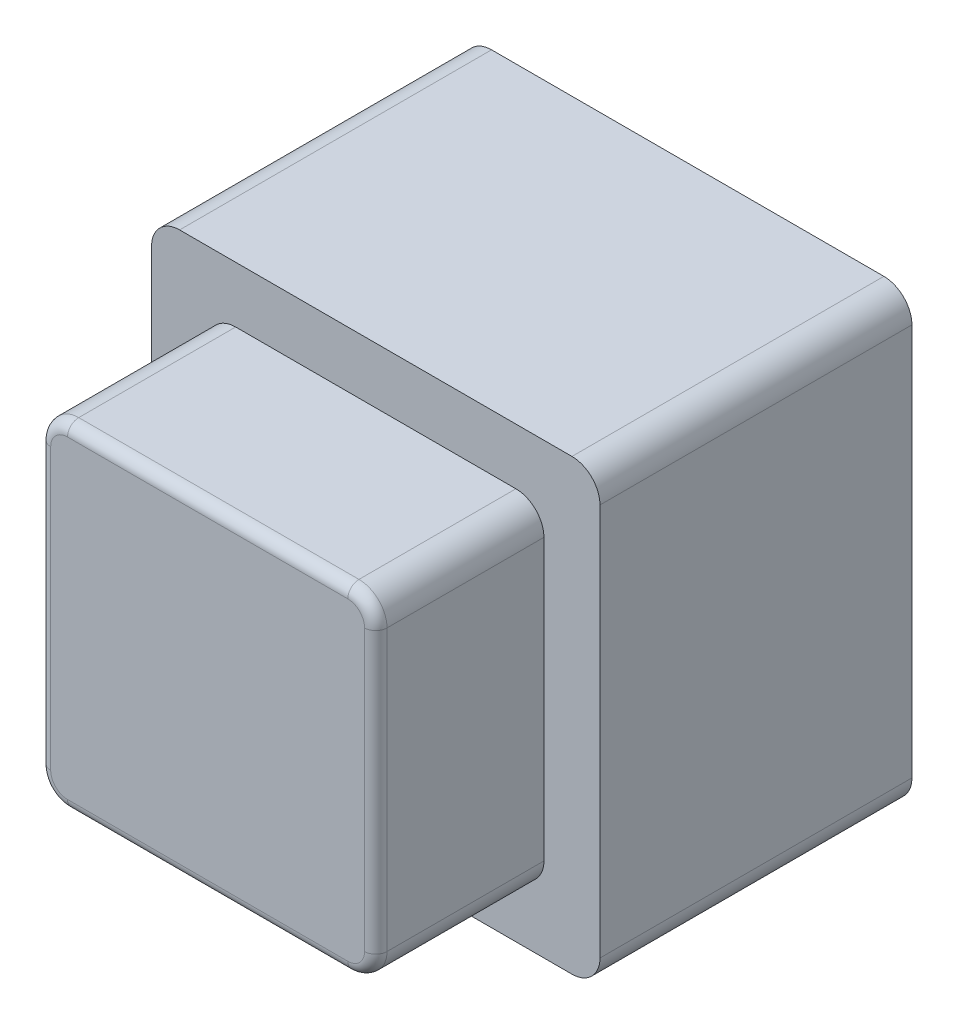
ISO-10303-21;
HEADER;
FILE_DESCRIPTION(('STEP AP214'),'2;1');
FILE_NAME('part.step','',(''),(''),'','','');
FILE_SCHEMA(('AUTOMOTIVE_DESIGN { 1 0 10303 214 1 1 1 1 }'));
ENDSEC;
DATA;
#1=APPLICATION_CONTEXT('core data for automotive mechanical design processes');
#2=APPLICATION_PROTOCOL_DEFINITION('international standard','automotive_design',2000,#1);
#3=PRODUCT_CONTEXT('',#1,'mechanical');
#4=PRODUCT('Part','Part','',(#3));
#5=PRODUCT_RELATED_PRODUCT_CATEGORY('part','',(#4));
#6=PRODUCT_DEFINITION_FORMATION('','',#4);
#7=PRODUCT_DEFINITION_CONTEXT('part definition',#1,'design');
#8=PRODUCT_DEFINITION('design','',#6,#7);
#9=PRODUCT_DEFINITION_SHAPE('','',#8);
#10=(LENGTH_UNIT() NAMED_UNIT(*) SI_UNIT(.MILLI.,.METRE.));
#11=(NAMED_UNIT(*) PLANE_ANGLE_UNIT() SI_UNIT($,.RADIAN.));
#12=(NAMED_UNIT(*) SI_UNIT($,.STERADIAN.) SOLID_ANGLE_UNIT());
#13=UNCERTAINTY_MEASURE_WITH_UNIT(LENGTH_MEASURE(1.E-05),#10,'distance_accuracy_value','');
#14=(GEOMETRIC_REPRESENTATION_CONTEXT(3) GLOBAL_UNCERTAINTY_ASSIGNED_CONTEXT((#13)) GLOBAL_UNIT_ASSIGNED_CONTEXT((#10,
#11,#12)) REPRESENTATION_CONTEXT('',''));
#15=CARTESIAN_POINT('',(0.,0.,0.));
#16=DIRECTION('',(0.,0.,1.));
#17=DIRECTION('',(1.,0.,0.));
#18=AXIS2_PLACEMENT_3D('',#15,#16,#17);
#19=CARTESIAN_POINT('',(-2.5,-2.5,3.));
#20=DIRECTION('',(0.,0.,-1.));
#21=DIRECTION('',(-1.,0.,0.));
#22=AXIS2_PLACEMENT_3D('',#19,#20,#21);
#23=CYLINDRICAL_SURFACE('',#22,0.5);
#24=DIRECTION('',(0.,0.,-1.));
#25=VECTOR('',#24,1.);
#26=CARTESIAN_POINT('',(-2.5,-3.,3.));
#27=LINE('',#26,#25);
#28=CARTESIAN_POINT('',(-2.5,-3.,2.8));
#29=VERTEX_POINT('',#28);
#30=CARTESIAN_POINT('',(-2.5,-3.,0.));
#31=VERTEX_POINT('',#30);
#32=EDGE_CURVE('E315',#29,#31,#27,.T.);
#33=ORIENTED_EDGE('',*,*,#32,.F.);
#34=CARTESIAN_POINT('',(-2.5,-2.5,2.8));
#35=DIRECTION('',(0.,0.,-1.));
#36=DIRECTION('',(-1.,0.,0.));
#37=AXIS2_PLACEMENT_3D('',#34,#35,#36);
#38=CIRCLE('',#37,0.5);
#39=CARTESIAN_POINT('',(-3.,-2.5,2.8));
#40=VERTEX_POINT('',#39);
#41=EDGE_CURVE('E354',#29,#40,#38,.T.);
#42=ORIENTED_EDGE('',*,*,#41,.T.);
#43=DIRECTION('',(0.,0.,-1.));
#44=VECTOR('',#43,1.);
#45=CARTESIAN_POINT('',(-3.,-2.5,3.));
#46=LINE('',#45,#44);
#47=CARTESIAN_POINT('',(-3.,-2.5,0.));
#48=VERTEX_POINT('',#47);
#49=EDGE_CURVE('E289',#40,#48,#46,.T.);
#50=ORIENTED_EDGE('',*,*,#49,.T.);
#51=CARTESIAN_POINT('',(-2.5,-2.5,0.));
#52=DIRECTION('',(0.,0.,1.));
#53=DIRECTION('',(-1.,0.,0.));
#54=AXIS2_PLACEMENT_3D('',#51,#52,#53);
#55=CIRCLE('',#54,0.5);
#56=EDGE_CURVE('E257',#48,#31,#55,.T.);
#57=ORIENTED_EDGE('',*,*,#56,.T.);
#58=EDGE_LOOP('',(#33,#42,#50,#57));
#59=FACE_BOUND('',#58,.T.);
#60=ADVANCED_FACE('F39',(#59),#23,.T.);
#61=CARTESIAN_POINT('',(-2.5,-3.,3.));
#62=DIRECTION('',(0.,1.,0.));
#63=DIRECTION('',(0.,0.,1.));
#64=AXIS2_PLACEMENT_3D('',#61,#62,#63);
#65=PLANE('',#64);
#66=DIRECTION('',(0.,0.,-1.));
#67=VECTOR('',#66,1.);
#68=CARTESIAN_POINT('',(2.5,-3.,3.));
#69=LINE('',#68,#67);
#70=CARTESIAN_POINT('',(2.5,-3.,2.8));
#71=VERTEX_POINT('',#70);
#72=CARTESIAN_POINT('',(2.5,-3.,0.));
#73=VERTEX_POINT('',#72);
#74=EDGE_CURVE('E311',#71,#73,#69,.T.);
#75=ORIENTED_EDGE('',*,*,#74,.F.);
#76=DIRECTION('',(1.,0.,0.));
#77=VECTOR('',#76,1.);
#78=CARTESIAN_POINT('',(-2.5,-3.,2.8));
#79=LINE('',#78,#77);
#80=EDGE_CURVE('E351',#71,#29,#79,.F.);
#81=ORIENTED_EDGE('',*,*,#80,.T.);
#82=ORIENTED_EDGE('',*,*,#32,.T.);
#83=DIRECTION('',(1.,0.,0.));
#84=VECTOR('',#83,1.);
#85=CARTESIAN_POINT('',(-2.5,-3.,0.));
#86=LINE('',#85,#84);
#87=EDGE_CURVE('E261',#31,#73,#86,.T.);
#88=ORIENTED_EDGE('',*,*,#87,.T.);
#89=EDGE_LOOP('',(#75,#81,#82,#88));
#90=FACE_BOUND('',#89,.T.);
#91=ADVANCED_FACE('F410',(#90),#65,.F.);
#92=CARTESIAN_POINT('',(2.5,-2.5,3.));
#93=DIRECTION('',(0.,0.,-1.));
#94=DIRECTION('',(-1.,0.,0.));
#95=AXIS2_PLACEMENT_3D('',#92,#93,#94);
#96=CYLINDRICAL_SURFACE('',#95,0.5);
#97=DIRECTION('',(0.,0.,-1.));
#98=VECTOR('',#97,1.);
#99=CARTESIAN_POINT('',(3.,-2.5,3.));
#100=LINE('',#99,#98);
#101=CARTESIAN_POINT('',(3.,-2.5,2.8));
#102=VERTEX_POINT('',#101);
#103=CARTESIAN_POINT('',(3.,-2.5,0.));
#104=VERTEX_POINT('',#103);
#105=EDGE_CURVE('E307',#102,#104,#100,.T.);
#106=ORIENTED_EDGE('',*,*,#105,.F.);
#107=CARTESIAN_POINT('',(2.5,-2.5,2.8));
#108=DIRECTION('',(0.,0.,-1.));
#109=DIRECTION('',(-1.,0.,0.));
#110=AXIS2_PLACEMENT_3D('',#107,#108,#109);
#111=CIRCLE('',#110,0.5);
#112=EDGE_CURVE('E348',#102,#71,#111,.T.);
#113=ORIENTED_EDGE('',*,*,#112,.T.);
#114=ORIENTED_EDGE('',*,*,#74,.T.);
#115=CARTESIAN_POINT('',(2.5,-2.5,0.));
#116=DIRECTION('',(0.,0.,1.));
#117=DIRECTION('',(1.,0.,0.));
#118=AXIS2_PLACEMENT_3D('',#115,#116,#117);
#119=CIRCLE('',#118,0.5);
#120=EDGE_CURVE('E265',#73,#104,#119,.T.);
#121=ORIENTED_EDGE('',*,*,#120,.T.);
#122=EDGE_LOOP('',(#106,#113,#114,#121));
#123=FACE_BOUND('',#122,.T.);
#124=ADVANCED_FACE('F458',(#123),#96,.T.);
#125=CARTESIAN_POINT('',(3.,-2.5,3.));
#126=DIRECTION('',(-1.,0.,0.));
#127=DIRECTION('',(0.,0.,1.));
#128=AXIS2_PLACEMENT_3D('',#125,#126,#127);
#129=PLANE('',#128);
#130=DIRECTION('',(0.,0.,-1.));
#131=VECTOR('',#130,1.);
#132=CARTESIAN_POINT('',(3.,2.5,3.));
#133=LINE('',#132,#131);
#134=CARTESIAN_POINT('',(3.,2.5,2.8));
#135=VERTEX_POINT('',#134);
#136=CARTESIAN_POINT('',(3.,2.5,0.));
#137=VERTEX_POINT('',#136);
#138=EDGE_CURVE('E303',#135,#137,#133,.T.);
#139=ORIENTED_EDGE('',*,*,#138,.F.);
#140=DIRECTION('',(0.,1.,0.));
#141=VECTOR('',#140,1.);
#142=CARTESIAN_POINT('',(3.,-2.5,2.8));
#143=LINE('',#142,#141);
#144=EDGE_CURVE('E344',#135,#102,#143,.F.);
#145=ORIENTED_EDGE('',*,*,#144,.T.);
#146=ORIENTED_EDGE('',*,*,#105,.T.);
#147=DIRECTION('',(0.,1.,0.));
#148=VECTOR('',#147,1.);
#149=CARTESIAN_POINT('',(3.,-2.5,0.));
#150=LINE('',#149,#148);
#151=EDGE_CURVE('E269',#104,#137,#150,.T.);
#152=ORIENTED_EDGE('',*,*,#151,.T.);
#153=EDGE_LOOP('',(#139,#145,#146,#152));
#154=FACE_BOUND('',#153,.T.);
#155=ADVANCED_FACE('F440',(#154),#129,.F.);
#156=CARTESIAN_POINT('',(2.5,2.5,3.));
#157=DIRECTION('',(0.,0.,-1.));
#158=DIRECTION('',(-1.,0.,0.));
#159=AXIS2_PLACEMENT_3D('',#156,#157,#158);
#160=CYLINDRICAL_SURFACE('',#159,0.5);
#161=DIRECTION('',(0.,0.,-1.));
#162=VECTOR('',#161,1.);
#163=CARTESIAN_POINT('',(2.5,3.,3.));
#164=LINE('',#163,#162);
#165=CARTESIAN_POINT('',(2.5,3.,2.8));
#166=VERTEX_POINT('',#165);
#167=CARTESIAN_POINT('',(2.5,3.,0.));
#168=VERTEX_POINT('',#167);
#169=EDGE_CURVE('E300',#166,#168,#164,.T.);
#170=ORIENTED_EDGE('',*,*,#169,.F.);
#171=CARTESIAN_POINT('',(2.5,2.5,2.8));
#172=DIRECTION('',(0.,0.,-1.));
#173=DIRECTION('',(-1.,0.,0.));
#174=AXIS2_PLACEMENT_3D('',#171,#172,#173);
#175=CIRCLE('',#174,0.5);
#176=EDGE_CURVE('E11',#166,#135,#175,.T.);
#177=ORIENTED_EDGE('',*,*,#176,.T.);
#178=ORIENTED_EDGE('',*,*,#138,.T.);
#179=CARTESIAN_POINT('',(2.5,2.5,0.));
#180=DIRECTION('',(0.,0.,1.));
#181=DIRECTION('',(-1.,0.,0.));
#182=AXIS2_PLACEMENT_3D('',#179,#180,#181);
#183=CIRCLE('',#182,0.5);
#184=EDGE_CURVE('E273',#137,#168,#183,.T.);
#185=ORIENTED_EDGE('',*,*,#184,.T.);
#186=EDGE_LOOP('',(#170,#177,#178,#185));
#187=FACE_BOUND('',#186,.T.);
#188=ADVANCED_FACE('F437',(#187),#160,.T.);
#189=CARTESIAN_POINT('',(-2.5,3.,3.));
#190=DIRECTION('',(0.,-1.,0.));
#191=DIRECTION('',(0.,0.,-1.));
#192=AXIS2_PLACEMENT_3D('',#189,#190,#191);
#193=PLANE('',#192);
#194=DIRECTION('',(0.,0.,-1.));
#195=VECTOR('',#194,1.);
#196=CARTESIAN_POINT('',(-2.5,3.,3.));
#197=LINE('',#196,#195);
#198=CARTESIAN_POINT('',(-2.5,3.,2.8));
#199=VERTEX_POINT('',#198);
#200=CARTESIAN_POINT('',(-2.5,3.,0.));
#201=VERTEX_POINT('',#200);
#202=EDGE_CURVE('E297',#199,#201,#197,.T.);
#203=ORIENTED_EDGE('',*,*,#202,.F.);
#204=DIRECTION('',(-1.,0.,0.));
#205=VECTOR('',#204,1.);
#206=CARTESIAN_POINT('',(-2.5,3.,2.8));
#207=LINE('',#206,#205);
#208=EDGE_CURVE('E49',#199,#166,#207,.F.);
#209=ORIENTED_EDGE('',*,*,#208,.T.);
#210=ORIENTED_EDGE('',*,*,#169,.T.);
#211=DIRECTION('',(-1.,0.,0.));
#212=VECTOR('',#211,1.);
#213=CARTESIAN_POINT('',(-2.5,3.,0.));
#214=LINE('',#213,#212);
#215=EDGE_CURVE('E277',#168,#201,#214,.T.);
#216=ORIENTED_EDGE('',*,*,#215,.T.);
#217=EDGE_LOOP('',(#203,#209,#210,#216));
#218=FACE_BOUND('',#217,.T.);
#219=ADVANCED_FACE('F468',(#218),#193,.F.);
#220=CARTESIAN_POINT('',(-2.5,2.5,3.));
#221=DIRECTION('',(0.,0.,-1.));
#222=DIRECTION('',(-1.,0.,0.));
#223=AXIS2_PLACEMENT_3D('',#220,#221,#222);
#224=CYLINDRICAL_SURFACE('',#223,0.5);
#225=DIRECTION('',(0.,0.,-1.));
#226=VECTOR('',#225,1.);
#227=CARTESIAN_POINT('',(-3.,2.5,3.));
#228=LINE('',#227,#226);
#229=CARTESIAN_POINT('',(-3.,2.5,2.8));
#230=VERTEX_POINT('',#229);
#231=CARTESIAN_POINT('',(-3.,2.5,0.));
#232=VERTEX_POINT('',#231);
#233=EDGE_CURVE('E293',#230,#232,#228,.T.);
#234=ORIENTED_EDGE('',*,*,#233,.F.);
#235=CARTESIAN_POINT('',(-2.5,2.5,2.8));
#236=DIRECTION('',(0.,0.,-1.));
#237=DIRECTION('',(-1.,0.,0.));
#238=AXIS2_PLACEMENT_3D('',#235,#236,#237);
#239=CIRCLE('',#238,0.5);
#240=EDGE_CURVE('E64',#230,#199,#239,.T.);
#241=ORIENTED_EDGE('',*,*,#240,.T.);
#242=ORIENTED_EDGE('',*,*,#202,.T.);
#243=CARTESIAN_POINT('',(-2.5,2.5,0.));
#244=DIRECTION('',(0.,0.,1.));
#245=DIRECTION('',(-1.,0.,0.));
#246=AXIS2_PLACEMENT_3D('',#243,#244,#245);
#247=CIRCLE('',#246,0.5);
#248=EDGE_CURVE('E281',#201,#232,#247,.T.);
#249=ORIENTED_EDGE('',*,*,#248,.T.);
#250=EDGE_LOOP('',(#234,#241,#242,#249));
#251=FACE_BOUND('',#250,.T.);
#252=ADVANCED_FACE('F404',(#251),#224,.T.);
#253=CARTESIAN_POINT('',(-3.,-2.5,3.));
#254=DIRECTION('',(1.,0.,0.));
#255=DIRECTION('',(0.,0.,-1.));
#256=AXIS2_PLACEMENT_3D('',#253,#254,#255);
#257=PLANE('',#256);
#258=ORIENTED_EDGE('',*,*,#49,.F.);
#259=DIRECTION('',(0.,-1.,0.));
#260=VECTOR('',#259,1.);
#261=CARTESIAN_POINT('',(-3.,-2.5,2.8));
#262=LINE('',#261,#260);
#263=EDGE_CURVE('E357',#40,#230,#262,.F.);
#264=ORIENTED_EDGE('',*,*,#263,.T.);
#265=ORIENTED_EDGE('',*,*,#233,.T.);
#266=DIRECTION('',(0.,-1.,0.));
#267=VECTOR('',#266,1.);
#268=CARTESIAN_POINT('',(-3.,-2.5,0.));
#269=LINE('',#268,#267);
#270=EDGE_CURVE('E285',#232,#48,#269,.T.);
#271=ORIENTED_EDGE('',*,*,#270,.T.);
#272=EDGE_LOOP('',(#258,#264,#265,#271));
#273=FACE_BOUND('',#272,.T.);
#274=ADVANCED_FACE('F403',(#273),#257,.F.);
#275=CARTESIAN_POINT('',(-2.5,-2.5,3.));
#276=DIRECTION('',(0.,0.,-1.));
#277=DIRECTION('',(-1.,0.,0.));
#278=AXIS2_PLACEMENT_3D('',#275,#276,#277);
#279=PLANE('',#278);
#280=CARTESIAN_POINT('',(2.5,-2.5,3.));
#281=DIRECTION('',(0.,0.,-1.));
#282=DIRECTION('',(-1.,0.,0.));
#283=AXIS2_PLACEMENT_3D('',#280,#281,#282);
#284=CIRCLE('',#283,0.3);
#285=CARTESIAN_POINT('',(2.5,-2.8,3.));
#286=VERTEX_POINT('',#285);
#287=CARTESIAN_POINT('',(2.8,-2.5,3.));
#288=VERTEX_POINT('',#287);
#289=EDGE_CURVE('E337',#286,#288,#284,.F.);
#290=ORIENTED_EDGE('',*,*,#289,.T.);
#291=DIRECTION('',(0.,1.,0.));
#292=VECTOR('',#291,1.);
#293=CARTESIAN_POINT('',(2.8,-2.5,3.));
#294=LINE('',#293,#292);
#295=CARTESIAN_POINT('',(2.8,2.5,3.));
#296=VERTEX_POINT('',#295);
#297=EDGE_CURVE('E340',#288,#296,#294,.T.);
#298=ORIENTED_EDGE('',*,*,#297,.T.);
#299=CARTESIAN_POINT('',(2.5,2.5,3.));
#300=DIRECTION('',(0.,0.,-1.));
#301=DIRECTION('',(-1.,0.,0.));
#302=AXIS2_PLACEMENT_3D('',#299,#300,#301);
#303=CIRCLE('',#302,0.3);
#304=CARTESIAN_POINT('',(2.5,2.8,3.));
#305=VERTEX_POINT('',#304);
#306=EDGE_CURVE('E319',#296,#305,#303,.F.);
#307=ORIENTED_EDGE('',*,*,#306,.T.);
#308=DIRECTION('',(-1.,0.,0.));
#309=VECTOR('',#308,1.);
#310=CARTESIAN_POINT('',(-2.5,2.8,3.));
#311=LINE('',#310,#309);
#312=CARTESIAN_POINT('',(-2.5,2.8,3.));
#313=VERTEX_POINT('',#312);
#314=EDGE_CURVE('E322',#305,#313,#311,.T.);
#315=ORIENTED_EDGE('',*,*,#314,.T.);
#316=CARTESIAN_POINT('',(-2.5,2.5,3.));
#317=DIRECTION('',(0.,0.,-1.));
#318=DIRECTION('',(-1.,0.,0.));
#319=AXIS2_PLACEMENT_3D('',#316,#317,#318);
#320=CIRCLE('',#319,0.3);
#321=CARTESIAN_POINT('',(-2.8,2.5,3.));
#322=VERTEX_POINT('',#321);
#323=EDGE_CURVE('E325',#313,#322,#320,.F.);
#324=ORIENTED_EDGE('',*,*,#323,.T.);
#325=DIRECTION('',(0.,-1.,0.));
#326=VECTOR('',#325,1.);
#327=CARTESIAN_POINT('',(-2.8,-2.5,3.));
#328=LINE('',#327,#326);
#329=CARTESIAN_POINT('',(-2.8,-2.5,3.));
#330=VERTEX_POINT('',#329);
#331=EDGE_CURVE('E328',#322,#330,#328,.T.);
#332=ORIENTED_EDGE('',*,*,#331,.T.);
#333=CARTESIAN_POINT('',(-2.5,-2.5,3.));
#334=DIRECTION('',(0.,0.,-1.));
#335=DIRECTION('',(-1.,0.,0.));
#336=AXIS2_PLACEMENT_3D('',#333,#334,#335);
#337=CIRCLE('',#336,0.3);
#338=CARTESIAN_POINT('',(-2.5,-2.8,3.));
#339=VERTEX_POINT('',#338);
#340=EDGE_CURVE('E331',#330,#339,#337,.F.);
#341=ORIENTED_EDGE('',*,*,#340,.T.);
#342=DIRECTION('',(1.,0.,0.));
#343=VECTOR('',#342,1.);
#344=CARTESIAN_POINT('',(-2.5,-2.8,3.));
#345=LINE('',#344,#343);
#346=EDGE_CURVE('E334',#339,#286,#345,.T.);
#347=ORIENTED_EDGE('',*,*,#346,.T.);
#348=EDGE_LOOP('',(#290,#298,#307,#315,#324,#332,#341,#347));
#349=FACE_BOUND('',#348,.T.);
#350=ADVANCED_FACE('F423',(#349),#279,.F.);
#351=CARTESIAN_POINT('',(-2.8,-2.5,2.8));
#352=DIRECTION('',(0.,-1.,0.));
#353=DIRECTION('',(0.,0.,-1.));
#354=AXIS2_PLACEMENT_3D('',#351,#352,#353);
#355=CYLINDRICAL_SURFACE('',#354,0.2);
#356=CARTESIAN_POINT('',(-2.8,2.5,2.8));
#357=DIRECTION('',(0.,1.,0.));
#358=DIRECTION('',(0.,0.,1.));
#359=AXIS2_PLACEMENT_3D('',#356,#357,#358);
#360=CIRCLE('',#359,0.2);
#361=EDGE_CURVE('E384',#230,#322,#360,.T.);
#362=ORIENTED_EDGE('',*,*,#361,.F.);
#363=ORIENTED_EDGE('',*,*,#263,.F.);
#364=CARTESIAN_POINT('',(-2.8,-2.5,2.8));
#365=DIRECTION('',(0.,-1.,0.));
#366=DIRECTION('',(0.,0.,-1.));
#367=AXIS2_PLACEMENT_3D('',#364,#365,#366);
#368=CIRCLE('',#367,0.2);
#369=EDGE_CURVE('E43',#330,#40,#368,.T.);
#370=ORIENTED_EDGE('',*,*,#369,.F.);
#371=ORIENTED_EDGE('',*,*,#331,.F.);
#372=EDGE_LOOP('',(#362,#363,#370,#371));
#373=FACE_BOUND('',#372,.T.);
#374=ADVANCED_FACE('F41',(#373),#355,.T.);
#375=CARTESIAN_POINT('',(-2.5,-2.5,2.8));
#376=DIRECTION('',(0.,0.,-1.));
#377=DIRECTION('',(-1.,0.,0.));
#378=AXIS2_PLACEMENT_3D('',#375,#376,#377);
#379=TOROIDAL_SURFACE('',#378,0.3,0.2);
#380=ORIENTED_EDGE('',*,*,#369,.T.);
#381=ORIENTED_EDGE('',*,*,#41,.F.);
#382=CARTESIAN_POINT('',(-2.5,-2.8,2.8));
#383=DIRECTION('',(1.,0.,0.));
#384=DIRECTION('',(0.,0.,-1.));
#385=AXIS2_PLACEMENT_3D('',#382,#383,#384);
#386=CIRCLE('',#385,0.2);
#387=EDGE_CURVE('E381',#339,#29,#386,.T.);
#388=ORIENTED_EDGE('',*,*,#387,.F.);
#389=ORIENTED_EDGE('',*,*,#340,.F.);
#390=EDGE_LOOP('',(#380,#381,#388,#389));
#391=FACE_BOUND('',#390,.T.);
#392=ADVANCED_FACE('F396',(#391),#379,.T.);
#393=CARTESIAN_POINT('',(-2.5,2.5,2.8));
#394=DIRECTION('',(0.,0.,-1.));
#395=DIRECTION('',(-1.,0.,0.));
#396=AXIS2_PLACEMENT_3D('',#393,#394,#395);
#397=TOROIDAL_SURFACE('',#396,0.3,0.2);
#398=ORIENTED_EDGE('',*,*,#361,.T.);
#399=ORIENTED_EDGE('',*,*,#323,.F.);
#400=CARTESIAN_POINT('',(-2.5,2.8,2.8));
#401=DIRECTION('',(1.,0.,0.));
#402=DIRECTION('',(0.,0.,-1.));
#403=AXIS2_PLACEMENT_3D('',#400,#401,#402);
#404=CIRCLE('',#403,0.2);
#405=EDGE_CURVE('E377',#199,#313,#404,.T.);
#406=ORIENTED_EDGE('',*,*,#405,.F.);
#407=ORIENTED_EDGE('',*,*,#240,.F.);
#408=EDGE_LOOP('',(#398,#399,#406,#407));
#409=FACE_BOUND('',#408,.T.);
#410=ADVANCED_FACE('F426',(#409),#397,.T.);
#411=CARTESIAN_POINT('',(-2.5,-2.8,2.8));
#412=DIRECTION('',(1.,0.,0.));
#413=DIRECTION('',(0.,0.,-1.));
#414=AXIS2_PLACEMENT_3D('',#411,#412,#413);
#415=CYLINDRICAL_SURFACE('',#414,0.2);
#416=ORIENTED_EDGE('',*,*,#387,.T.);
#417=ORIENTED_EDGE('',*,*,#80,.F.);
#418=CARTESIAN_POINT('',(2.5,-2.8,2.8));
#419=DIRECTION('',(1.,0.,0.));
#420=DIRECTION('',(0.,0.,-1.));
#421=AXIS2_PLACEMENT_3D('',#418,#419,#420);
#422=CIRCLE('',#421,0.2);
#423=EDGE_CURVE('E373',#286,#71,#422,.T.);
#424=ORIENTED_EDGE('',*,*,#423,.F.);
#425=ORIENTED_EDGE('',*,*,#346,.F.);
#426=EDGE_LOOP('',(#416,#417,#424,#425));
#427=FACE_BOUND('',#426,.T.);
#428=ADVANCED_FACE('F414',(#427),#415,.T.);
#429=CARTESIAN_POINT('',(-2.5,2.8,2.8));
#430=DIRECTION('',(-1.,0.,0.));
#431=DIRECTION('',(0.,0.,1.));
#432=AXIS2_PLACEMENT_3D('',#429,#430,#431);
#433=CYLINDRICAL_SURFACE('',#432,0.2);
#434=ORIENTED_EDGE('',*,*,#405,.T.);
#435=ORIENTED_EDGE('',*,*,#314,.F.);
#436=CARTESIAN_POINT('',(2.5,2.8,2.8));
#437=DIRECTION('',(1.,0.,0.));
#438=DIRECTION('',(0.,0.,-1.));
#439=AXIS2_PLACEMENT_3D('',#436,#437,#438);
#440=CIRCLE('',#439,0.2);
#441=EDGE_CURVE('E369',#166,#305,#440,.T.);
#442=ORIENTED_EDGE('',*,*,#441,.F.);
#443=ORIENTED_EDGE('',*,*,#208,.F.);
#444=EDGE_LOOP('',(#434,#435,#442,#443));
#445=FACE_BOUND('',#444,.T.);
#446=ADVANCED_FACE('F428',(#445),#433,.T.);
#447=CARTESIAN_POINT('',(2.5,-2.5,2.8));
#448=DIRECTION('',(0.,0.,-1.));
#449=DIRECTION('',(-1.,0.,0.));
#450=AXIS2_PLACEMENT_3D('',#447,#448,#449);
#451=TOROIDAL_SURFACE('',#450,0.3,0.2);
#452=ORIENTED_EDGE('',*,*,#423,.T.);
#453=ORIENTED_EDGE('',*,*,#112,.F.);
#454=CARTESIAN_POINT('',(2.8,-2.5,2.8));
#455=DIRECTION('',(0.,1.,0.));
#456=DIRECTION('',(0.,0.,1.));
#457=AXIS2_PLACEMENT_3D('',#454,#455,#456);
#458=CIRCLE('',#457,0.2);
#459=EDGE_CURVE('E366',#288,#102,#458,.T.);
#460=ORIENTED_EDGE('',*,*,#459,.F.);
#461=ORIENTED_EDGE('',*,*,#289,.F.);
#462=EDGE_LOOP('',(#452,#453,#460,#461));
#463=FACE_BOUND('',#462,.T.);
#464=ADVANCED_FACE('F419',(#463),#451,.T.);
#465=CARTESIAN_POINT('',(2.5,2.5,2.8));
#466=DIRECTION('',(0.,0.,-1.));
#467=DIRECTION('',(-1.,0.,0.));
#468=AXIS2_PLACEMENT_3D('',#465,#466,#467);
#469=TOROIDAL_SURFACE('',#468,0.3,0.2);
#470=ORIENTED_EDGE('',*,*,#441,.T.);
#471=ORIENTED_EDGE('',*,*,#306,.F.);
#472=CARTESIAN_POINT('',(2.8,2.5,2.8));
#473=DIRECTION('',(0.,-1.,0.));
#474=DIRECTION('',(0.,0.,-1.));
#475=AXIS2_PLACEMENT_3D('',#472,#473,#474);
#476=CIRCLE('',#475,0.2);
#477=EDGE_CURVE('E256',#135,#296,#476,.T.);
#478=ORIENTED_EDGE('',*,*,#477,.F.);
#479=ORIENTED_EDGE('',*,*,#176,.F.);
#480=EDGE_LOOP('',(#470,#471,#478,#479));
#481=FACE_BOUND('',#480,.T.);
#482=ADVANCED_FACE('F434',(#481),#469,.T.);
#483=CARTESIAN_POINT('',(2.8,-2.5,2.8));
#484=DIRECTION('',(0.,1.,0.));
#485=DIRECTION('',(0.,0.,1.));
#486=AXIS2_PLACEMENT_3D('',#483,#484,#485);
#487=CYLINDRICAL_SURFACE('',#486,0.2);
#488=ORIENTED_EDGE('',*,*,#459,.T.);
#489=ORIENTED_EDGE('',*,*,#144,.F.);
#490=ORIENTED_EDGE('',*,*,#477,.T.);
#491=ORIENTED_EDGE('',*,*,#297,.F.);
#492=EDGE_LOOP('',(#488,#489,#490,#491));
#493=FACE_BOUND('',#492,.T.);
#494=ADVANCED_FACE('F443',(#493),#487,.T.);
#495=CARTESIAN_POINT('',(-3.5,-3.5,-16.8791062448463));
#496=DIRECTION('',(0.,0.,1.));
#497=DIRECTION('',(1.,0.,0.));
#498=AXIS2_PLACEMENT_3D('',#495,#496,#497);
#499=CYLINDRICAL_SURFACE('',#498,0.5);
#500=CARTESIAN_POINT('',(-3.5,-3.5,-5.5653977458615));
#501=DIRECTION('',(0.,0.,1.));
#502=DIRECTION('',(1.,0.,0.));
#503=AXIS2_PLACEMENT_3D('',#500,#501,#502);
#504=CIRCLE('',#503,0.5);
#505=CARTESIAN_POINT('',(-3.5,-4.,-5.5653977458615));
#506=VERTEX_POINT('',#505);
#507=CARTESIAN_POINT('',(-4.,-3.5,-5.5653977458615));
#508=VERTEX_POINT('',#507);
#509=EDGE_CURVE('E188',#506,#508,#504,.F.);
#510=ORIENTED_EDGE('',*,*,#509,.F.);
#511=DIRECTION('',(0.,0.,1.));
#512=VECTOR('',#511,1.);
#513=CARTESIAN_POINT('',(-3.5,-4.,-16.8791062448463));
#514=LINE('',#513,#512);
#515=CARTESIAN_POINT('',(-3.5,-4.,0.));
#516=VERTEX_POINT('',#515);
#517=EDGE_CURVE('E181',#506,#516,#514,.T.);
#518=ORIENTED_EDGE('',*,*,#517,.T.);
#519=CARTESIAN_POINT('',(-3.5,-3.5,0.));
#520=DIRECTION('',(0.,0.,1.));
#521=DIRECTION('',(-1.,0.,0.));
#522=AXIS2_PLACEMENT_3D('',#519,#520,#521);
#523=CIRCLE('',#522,0.5);
#524=CARTESIAN_POINT('',(-4.,-3.5,0.));
#525=VERTEX_POINT('',#524);
#526=EDGE_CURVE('E186',#525,#516,#523,.T.);
#527=ORIENTED_EDGE('',*,*,#526,.F.);
#528=DIRECTION('',(0.,0.,1.));
#529=VECTOR('',#528,1.);
#530=CARTESIAN_POINT('',(-4.,-3.5,-16.8791062448463));
#531=LINE('',#530,#529);
#532=EDGE_CURVE('E232',#508,#525,#531,.T.);
#533=ORIENTED_EDGE('',*,*,#532,.F.);
#534=EDGE_LOOP('',(#510,#518,#527,#533));
#535=FACE_BOUND('',#534,.T.);
#536=ADVANCED_FACE('F183',(#535),#499,.T.);
#537=CARTESIAN_POINT('',(-4.,-3.5,-16.8791062448463));
#538=DIRECTION('',(-1.,0.,0.));
#539=DIRECTION('',(0.,0.,1.));
#540=AXIS2_PLACEMENT_3D('',#537,#538,#539);
#541=PLANE('',#540);
#542=DIRECTION('',(0.,1.,0.));
#543=VECTOR('',#542,1.);
#544=CARTESIAN_POINT('',(-4.,-3.5,-5.5653977458615));
#545=LINE('',#544,#543);
#546=CARTESIAN_POINT('',(-4.,3.5,-5.5653977458615));
#547=VERTEX_POINT('',#546);
#548=EDGE_CURVE('E510',#508,#547,#545,.T.);
#549=ORIENTED_EDGE('',*,*,#548,.F.);
#550=ORIENTED_EDGE('',*,*,#532,.T.);
#551=DIRECTION('',(0.,-1.,0.));
#552=VECTOR('',#551,1.);
#553=CARTESIAN_POINT('',(-4.,-3.5,0.));
#554=LINE('',#553,#552);
#555=CARTESIAN_POINT('',(-4.,3.5,0.));
#556=VERTEX_POINT('',#555);
#557=EDGE_CURVE('E193',#556,#525,#554,.T.);
#558=ORIENTED_EDGE('',*,*,#557,.F.);
#559=DIRECTION('',(0.,0.,1.));
#560=VECTOR('',#559,1.);
#561=CARTESIAN_POINT('',(-4.,3.5,-16.8791062448463));
#562=LINE('',#561,#560);
#563=EDGE_CURVE('E236',#547,#556,#562,.T.);
#564=ORIENTED_EDGE('',*,*,#563,.F.);
#565=EDGE_LOOP('',(#549,#550,#558,#564));
#566=FACE_BOUND('',#565,.T.);
#567=ADVANCED_FACE('F450',(#566),#541,.T.);
#568=CARTESIAN_POINT('',(-3.5,3.5,-16.8791062448463));
#569=DIRECTION('',(0.,0.,1.));
#570=DIRECTION('',(1.,0.,0.));
#571=AXIS2_PLACEMENT_3D('',#568,#569,#570);
#572=CYLINDRICAL_SURFACE('',#571,0.5);
#573=CARTESIAN_POINT('',(-3.5,3.5,-5.5653977458615));
#574=DIRECTION('',(0.,0.,1.));
#575=DIRECTION('',(1.,0.,0.));
#576=AXIS2_PLACEMENT_3D('',#573,#574,#575);
#577=CIRCLE('',#576,0.5);
#578=CARTESIAN_POINT('',(-3.5,4.,-5.5653977458615));
#579=VERTEX_POINT('',#578);
#580=EDGE_CURVE('E515',#547,#579,#577,.F.);
#581=ORIENTED_EDGE('',*,*,#580,.F.);
#582=ORIENTED_EDGE('',*,*,#563,.T.);
#583=CARTESIAN_POINT('',(-3.5,3.5,0.));
#584=DIRECTION('',(0.,0.,1.));
#585=DIRECTION('',(-1.,0.,0.));
#586=AXIS2_PLACEMENT_3D('',#583,#584,#585);
#587=CIRCLE('',#586,0.5);
#588=CARTESIAN_POINT('',(-3.5,4.,0.));
#589=VERTEX_POINT('',#588);
#590=EDGE_CURVE('E227',#589,#556,#587,.T.);
#591=ORIENTED_EDGE('',*,*,#590,.F.);
#592=DIRECTION('',(0.,0.,1.));
#593=VECTOR('',#592,1.);
#594=CARTESIAN_POINT('',(-3.5,4.,-16.8791062448463));
#595=LINE('',#594,#593);
#596=EDGE_CURVE('E239',#579,#589,#595,.T.);
#597=ORIENTED_EDGE('',*,*,#596,.F.);
#598=EDGE_LOOP('',(#581,#582,#591,#597));
#599=FACE_BOUND('',#598,.T.);
#600=ADVANCED_FACE('F494',(#599),#572,.T.);
#601=CARTESIAN_POINT('',(-3.5,4.,-16.8791062448463));
#602=DIRECTION('',(0.,1.,0.));
#603=DIRECTION('',(0.,0.,1.));
#604=AXIS2_PLACEMENT_3D('',#601,#602,#603);
#605=PLANE('',#604);
#606=DIRECTION('',(1.,0.,0.));
#607=VECTOR('',#606,1.);
#608=CARTESIAN_POINT('',(-3.5,4.,-5.5653977458615));
#609=LINE('',#608,#607);
#610=CARTESIAN_POINT('',(3.5,4.,-5.5653977458615));
#611=VERTEX_POINT('',#610);
#612=EDGE_CURVE('E517',#579,#611,#609,.T.);
#613=ORIENTED_EDGE('',*,*,#612,.F.);
#614=ORIENTED_EDGE('',*,*,#596,.T.);
#615=DIRECTION('',(-1.,0.,0.));
#616=VECTOR('',#615,1.);
#617=CARTESIAN_POINT('',(-3.5,4.,0.));
#618=LINE('',#617,#616);
#619=CARTESIAN_POINT('',(3.5,4.,0.));
#620=VERTEX_POINT('',#619);
#621=EDGE_CURVE('E223',#620,#589,#618,.T.);
#622=ORIENTED_EDGE('',*,*,#621,.F.);
#623=DIRECTION('',(0.,0.,1.));
#624=VECTOR('',#623,1.);
#625=CARTESIAN_POINT('',(3.5,4.,-16.8791062448463));
#626=LINE('',#625,#624);
#627=EDGE_CURVE('E242',#611,#620,#626,.T.);
#628=ORIENTED_EDGE('',*,*,#627,.F.);
#629=EDGE_LOOP('',(#613,#614,#622,#628));
#630=FACE_BOUND('',#629,.T.);
#631=ADVANCED_FACE('F490',(#630),#605,.T.);
#632=CARTESIAN_POINT('',(3.5,3.5,-16.8791062448463));
#633=DIRECTION('',(0.,0.,1.));
#634=DIRECTION('',(1.,0.,0.));
#635=AXIS2_PLACEMENT_3D('',#632,#633,#634);
#636=CYLINDRICAL_SURFACE('',#635,0.5);
#637=CARTESIAN_POINT('',(3.5,3.5,-5.5653977458615));
#638=DIRECTION('',(0.,0.,1.));
#639=DIRECTION('',(1.,0.,0.));
#640=AXIS2_PLACEMENT_3D('',#637,#638,#639);
#641=CIRCLE('',#640,0.5);
#642=CARTESIAN_POINT('',(4.,3.5,-5.5653977458615));
#643=VERTEX_POINT('',#642);
#644=EDGE_CURVE('E522',#611,#643,#641,.F.);
#645=ORIENTED_EDGE('',*,*,#644,.F.);
#646=ORIENTED_EDGE('',*,*,#627,.T.);
#647=CARTESIAN_POINT('',(3.5,3.5,0.));
#648=DIRECTION('',(0.,0.,1.));
#649=DIRECTION('',(-1.,0.,0.));
#650=AXIS2_PLACEMENT_3D('',#647,#648,#649);
#651=CIRCLE('',#650,0.5);
#652=CARTESIAN_POINT('',(4.,3.5,0.));
#653=VERTEX_POINT('',#652);
#654=EDGE_CURVE('E219',#653,#620,#651,.T.);
#655=ORIENTED_EDGE('',*,*,#654,.F.);
#656=DIRECTION('',(0.,0.,1.));
#657=VECTOR('',#656,1.);
#658=CARTESIAN_POINT('',(4.,3.5,-16.8791062448463));
#659=LINE('',#658,#657);
#660=EDGE_CURVE('E245',#643,#653,#659,.T.);
#661=ORIENTED_EDGE('',*,*,#660,.F.);
#662=EDGE_LOOP('',(#645,#646,#655,#661));
#663=FACE_BOUND('',#662,.T.);
#664=ADVANCED_FACE('F486',(#663),#636,.T.);
#665=CARTESIAN_POINT('',(4.,-3.5,-16.8791062448463));
#666=DIRECTION('',(1.,0.,0.));
#667=DIRECTION('',(0.,0.,-1.));
#668=AXIS2_PLACEMENT_3D('',#665,#666,#667);
#669=PLANE('',#668);
#670=DIRECTION('',(0.,-1.,0.));
#671=VECTOR('',#670,1.);
#672=CARTESIAN_POINT('',(4.,-3.5,-5.5653977458615));
#673=LINE('',#672,#671);
#674=CARTESIAN_POINT('',(4.,-3.5,-5.5653977458615));
#675=VERTEX_POINT('',#674);
#676=EDGE_CURVE('E525',#643,#675,#673,.T.);
#677=ORIENTED_EDGE('',*,*,#676,.F.);
#678=ORIENTED_EDGE('',*,*,#660,.T.);
#679=DIRECTION('',(0.,1.,0.));
#680=VECTOR('',#679,1.);
#681=CARTESIAN_POINT('',(4.,-3.5,0.));
#682=LINE('',#681,#680);
#683=CARTESIAN_POINT('',(4.,-3.5,0.));
#684=VERTEX_POINT('',#683);
#685=EDGE_CURVE('E215',#684,#653,#682,.T.);
#686=ORIENTED_EDGE('',*,*,#685,.F.);
#687=DIRECTION('',(0.,0.,1.));
#688=VECTOR('',#687,1.);
#689=CARTESIAN_POINT('',(4.,-3.5,-16.8791062448463));
#690=LINE('',#689,#688);
#691=EDGE_CURVE('E248',#675,#684,#690,.T.);
#692=ORIENTED_EDGE('',*,*,#691,.F.);
#693=EDGE_LOOP('',(#677,#678,#686,#692));
#694=FACE_BOUND('',#693,.T.);
#695=ADVANCED_FACE('F482',(#694),#669,.T.);
#696=CARTESIAN_POINT('',(3.5,-3.5,-16.8791062448463));
#697=DIRECTION('',(0.,0.,1.));
#698=DIRECTION('',(1.,0.,0.));
#699=AXIS2_PLACEMENT_3D('',#696,#697,#698);
#700=CYLINDRICAL_SURFACE('',#699,0.5);
#701=CARTESIAN_POINT('',(3.5,-3.5,-5.5653977458615));
#702=DIRECTION('',(0.,0.,1.));
#703=DIRECTION('',(1.,0.,0.));
#704=AXIS2_PLACEMENT_3D('',#701,#702,#703);
#705=CIRCLE('',#704,0.5);
#706=CARTESIAN_POINT('',(3.5,-4.,-5.5653977458615));
#707=VERTEX_POINT('',#706);
#708=EDGE_CURVE('E235',#675,#707,#705,.F.);
#709=ORIENTED_EDGE('',*,*,#708,.F.);
#710=ORIENTED_EDGE('',*,*,#691,.T.);
#711=CARTESIAN_POINT('',(3.5,-3.5,0.));
#712=DIRECTION('',(0.,0.,1.));
#713=DIRECTION('',(1.,0.,0.));
#714=AXIS2_PLACEMENT_3D('',#711,#712,#713);
#715=CIRCLE('',#714,0.5);
#716=CARTESIAN_POINT('',(3.5,-4.,0.));
#717=VERTEX_POINT('',#716);
#718=EDGE_CURVE('E203',#717,#684,#715,.T.);
#719=ORIENTED_EDGE('',*,*,#718,.F.);
#720=DIRECTION('',(0.,0.,1.));
#721=VECTOR('',#720,1.);
#722=CARTESIAN_POINT('',(3.5,-4.,-16.8791062448463));
#723=LINE('',#722,#721);
#724=EDGE_CURVE('E192',#707,#717,#723,.T.);
#725=ORIENTED_EDGE('',*,*,#724,.F.);
#726=EDGE_LOOP('',(#709,#710,#719,#725));
#727=FACE_BOUND('',#726,.T.);
#728=ADVANCED_FACE('F479',(#727),#700,.T.);
#729=CARTESIAN_POINT('',(-3.5,-4.,-16.8791062448463));
#730=DIRECTION('',(0.,-1.,0.));
#731=DIRECTION('',(0.,0.,-1.));
#732=AXIS2_PLACEMENT_3D('',#729,#730,#731);
#733=PLANE('',#732);
#734=DIRECTION('',(-1.,0.,0.));
#735=VECTOR('',#734,1.);
#736=CARTESIAN_POINT('',(-3.5,-4.,-5.5653977458615));
#737=LINE('',#736,#735);
#738=EDGE_CURVE('E253',#707,#506,#737,.T.);
#739=ORIENTED_EDGE('',*,*,#738,.F.);
#740=ORIENTED_EDGE('',*,*,#724,.T.);
#741=DIRECTION('',(1.,0.,0.));
#742=VECTOR('',#741,1.);
#743=CARTESIAN_POINT('',(-3.5,-4.,0.));
#744=LINE('',#743,#742);
#745=EDGE_CURVE('E196',#516,#717,#744,.T.);
#746=ORIENTED_EDGE('',*,*,#745,.F.);
#747=ORIENTED_EDGE('',*,*,#517,.F.);
#748=EDGE_LOOP('',(#739,#740,#746,#747));
#749=FACE_BOUND('',#748,.T.);
#750=ADVANCED_FACE('F197',(#749),#733,.T.);
#751=CARTESIAN_POINT('',(-3.5,-3.5,0.));
#752=DIRECTION('',(0.,0.,-1.));
#753=DIRECTION('',(-1.,0.,0.));
#754=AXIS2_PLACEMENT_3D('',#751,#752,#753);
#755=PLANE('',#754);
#756=ORIENTED_EDGE('',*,*,#56,.F.);
#757=ORIENTED_EDGE('',*,*,#270,.F.);
#758=ORIENTED_EDGE('',*,*,#248,.F.);
#759=ORIENTED_EDGE('',*,*,#215,.F.);
#760=ORIENTED_EDGE('',*,*,#184,.F.);
#761=ORIENTED_EDGE('',*,*,#151,.F.);
#762=ORIENTED_EDGE('',*,*,#120,.F.);
#763=ORIENTED_EDGE('',*,*,#87,.F.);
#764=EDGE_LOOP('',(#756,#757,#758,#759,#760,#761,#762,#763));
#765=FACE_BOUND('',#764,.T.);
#766=ORIENTED_EDGE('',*,*,#526,.T.);
#767=ORIENTED_EDGE('',*,*,#745,.T.);
#768=ORIENTED_EDGE('',*,*,#718,.T.);
#769=ORIENTED_EDGE('',*,*,#685,.T.);
#770=ORIENTED_EDGE('',*,*,#654,.T.);
#771=ORIENTED_EDGE('',*,*,#621,.T.);
#772=ORIENTED_EDGE('',*,*,#590,.T.);
#773=ORIENTED_EDGE('',*,*,#557,.T.);
#774=EDGE_LOOP('',(#766,#767,#768,#769,#770,#771,#772,#773));
#775=FACE_BOUND('',#774,.T.);
#776=ADVANCED_FACE('F205',(#765,#775),#755,.F.);
#777=CARTESIAN_POINT('',(0.0458853136141896,0.0570079842284617,-5.5653977458615));
#778=DIRECTION('',(0.,0.,1.));
#779=DIRECTION('',(1.,0.,0.));
#780=AXIS2_PLACEMENT_3D('',#777,#778,#779);
#781=PLANE('',#780);
#782=ORIENTED_EDGE('',*,*,#509,.T.);
#783=ORIENTED_EDGE('',*,*,#548,.T.);
#784=ORIENTED_EDGE('',*,*,#580,.T.);
#785=ORIENTED_EDGE('',*,*,#612,.T.);
#786=ORIENTED_EDGE('',*,*,#644,.T.);
#787=ORIENTED_EDGE('',*,*,#676,.T.);
#788=ORIENTED_EDGE('',*,*,#708,.T.);
#789=ORIENTED_EDGE('',*,*,#738,.T.);
#790=EDGE_LOOP('',(#782,#783,#784,#785,#786,#787,#788,#789));
#791=FACE_BOUND('',#790,.T.);
#792=ADVANCED_FACE('F504',(#791),#781,.F.);
#793=CLOSED_SHELL('',(#60,#91,#124,#155,#188,#219,#252,#274,#350,#374,#392,#410,#428,#446,#464,
#482,#494,#536,#567,#600,#631,#664,#695,#728,#750,#776,#792));
#794=MANIFOLD_SOLID_BREP('B2',#793);
#795=ADVANCED_BREP_SHAPE_REPRESENTATION('',(#18,#794),#14);
#796=SHAPE_DEFINITION_REPRESENTATION(#9,#795);
ENDSEC;
END-ISO-10303-21;
